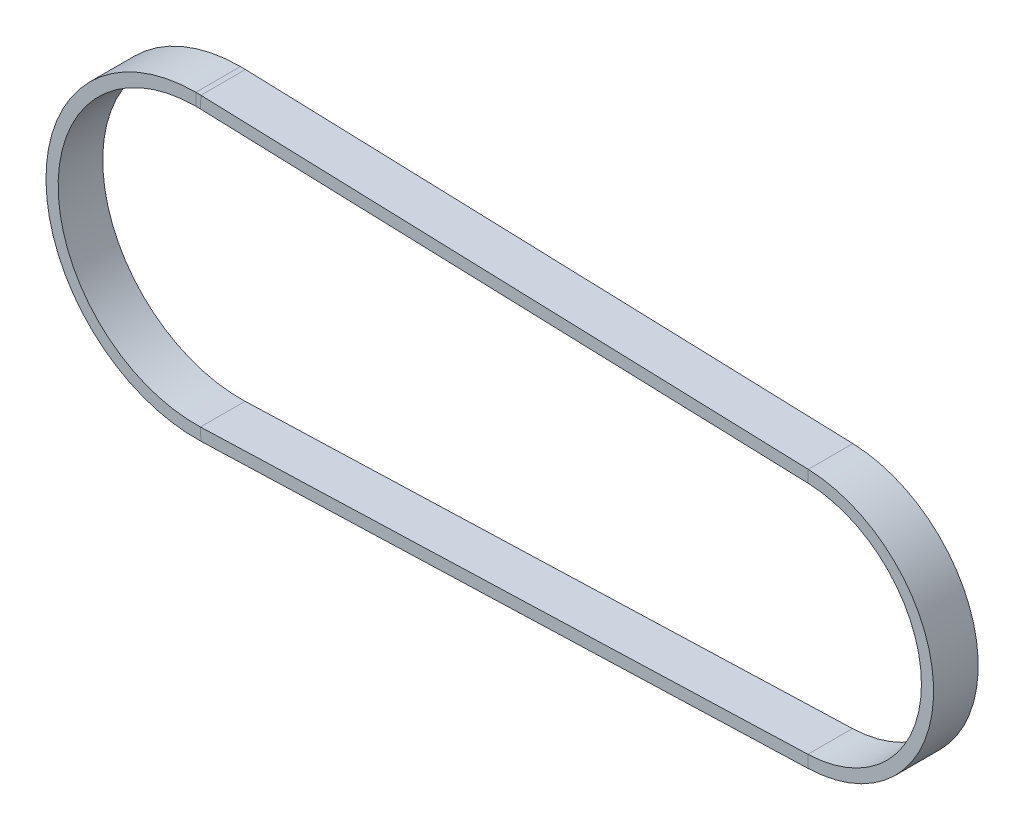
ISO-10303-21;
HEADER;
FILE_DESCRIPTION(('STEP AP214'),'2;1');
FILE_NAME('part.step','',(''),(''),'','','');
FILE_SCHEMA(('AUTOMOTIVE_DESIGN { 1 0 10303 214 1 1 1 1 }'));
ENDSEC;
DATA;
#1=APPLICATION_CONTEXT('core data for automotive mechanical design processes');
#2=APPLICATION_PROTOCOL_DEFINITION('international standard','automotive_design',2000,#1);
#3=PRODUCT_CONTEXT('',#1,'mechanical');
#4=PRODUCT('Part','Part','',(#3));
#5=PRODUCT_RELATED_PRODUCT_CATEGORY('part','',(#4));
#6=PRODUCT_DEFINITION_FORMATION('','',#4);
#7=PRODUCT_DEFINITION_CONTEXT('part definition',#1,'design');
#8=PRODUCT_DEFINITION('design','',#6,#7);
#9=PRODUCT_DEFINITION_SHAPE('','',#8);
#10=(LENGTH_UNIT() NAMED_UNIT(*) SI_UNIT(.MILLI.,.METRE.));
#11=(NAMED_UNIT(*) PLANE_ANGLE_UNIT() SI_UNIT($,.RADIAN.));
#12=(NAMED_UNIT(*) SI_UNIT($,.STERADIAN.) SOLID_ANGLE_UNIT());
#13=UNCERTAINTY_MEASURE_WITH_UNIT(LENGTH_MEASURE(1.E-05),#10,'distance_accuracy_value','');
#14=(GEOMETRIC_REPRESENTATION_CONTEXT(3) GLOBAL_UNCERTAINTY_ASSIGNED_CONTEXT((#13)) GLOBAL_UNIT_ASSIGNED_CONTEXT((#10,
#11,#12)) REPRESENTATION_CONTEXT('',''));
#15=CARTESIAN_POINT('',(0.,0.,0.));
#16=DIRECTION('',(0.,0.,1.));
#17=DIRECTION('',(1.,0.,0.));
#18=AXIS2_PLACEMENT_3D('',#15,#16,#17);
#19=CARTESIAN_POINT('',(1.23264795771311,-36.9588888888889,5.5));
#20=DIRECTION('',(0.,0.,1.));
#21=DIRECTION('',(1.,0.,0.));
#22=AXIS2_PLACEMENT_3D('',#19,#20,#21);
#23=PLANE('',#22);
#24=CARTESIAN_POINT('',(0.,0.,5.5));
#25=DIRECTION('',(0.,0.,-1.));
#26=DIRECTION('',(0.0333333333333332,-0.999444290037663,0.));
#27=AXIS2_PLACEMENT_3D('',#24,#25,#26);
#28=CIRCLE('',#27,36.9794387313936);
#29=CARTESIAN_POINT('',(1.23264795771311,-36.9588888888889,5.5));
#30=VERTEX_POINT('',#29);
#31=CARTESIAN_POINT('',(0.,36.9794387313936,5.5));
#32=VERTEX_POINT('',#31);
#33=EDGE_CURVE('E11',#30,#32,#28,.T.);
#34=ORIENTED_EDGE('',*,*,#33,.F.);
#35=DIRECTION('',(-0.0333333333333332,0.999444290037663,0.));
#36=VECTOR('',#35,1.);
#37=CARTESIAN_POINT('',(1.23264795771311,-36.9588888888889,5.5));
#38=LINE('',#37,#36);
#39=CARTESIAN_POINT('',(1.13264795771312,-33.9605560187759,5.5));
#40=VERTEX_POINT('',#39);
#41=EDGE_CURVE('E38',#30,#40,#38,.T.);
#42=ORIENTED_EDGE('',*,*,#41,.T.);
#43=CARTESIAN_POINT('',(0.,0.,5.5));
#44=DIRECTION('',(0.,0.,-1.));
#45=DIRECTION('',(0.0333333333333332,-0.999444290037663,0.));
#46=AXIS2_PLACEMENT_3D('',#43,#44,#45);
#47=CIRCLE('',#46,33.9794387313936);
#48=CARTESIAN_POINT('',(0.,33.9794387313936,5.5));
#49=VERTEX_POINT('',#48);
#50=EDGE_CURVE('E132',#40,#49,#47,.T.);
#51=ORIENTED_EDGE('',*,*,#50,.T.);
#52=DIRECTION('',(0.,-1.,0.));
#53=VECTOR('',#52,1.);
#54=CARTESIAN_POINT('',(0.,36.9794387313936,5.5));
#55=LINE('',#54,#53);
#56=EDGE_CURVE('E135',#32,#49,#55,.T.);
#57=ORIENTED_EDGE('',*,*,#56,.F.);
#58=EDGE_LOOP('',(#34,#42,#51,#57));
#59=FACE_BOUND('',#58,.T.);
#60=ADVANCED_FACE('F35',(#59),#23,.T.);
#61=CARTESIAN_POINT('',(0.,0.,0.));
#62=DIRECTION('',(0.,0.,-1.));
#63=DIRECTION('',(-1.,0.,0.));
#64=AXIS2_PLACEMENT_3D('',#61,#62,#63);
#65=CYLINDRICAL_SURFACE('',#64,36.9794387313936);
#66=CARTESIAN_POINT('',(0.,0.,-5.5));
#67=DIRECTION('',(0.,0.,-1.));
#68=DIRECTION('',(0.0333333333333332,-0.999444290037663,0.));
#69=AXIS2_PLACEMENT_3D('',#66,#67,#68);
#70=CIRCLE('',#69,36.9794387313936);
#71=CARTESIAN_POINT('',(1.23264795771311,-36.9588888888889,-5.5));
#72=VERTEX_POINT('',#71);
#73=CARTESIAN_POINT('',(0.,36.9794387313936,-5.5));
#74=VERTEX_POINT('',#73);
#75=EDGE_CURVE('E43',#72,#74,#70,.T.);
#76=ORIENTED_EDGE('',*,*,#75,.F.);
#77=DIRECTION('',(0.,0.,1.));
#78=VECTOR('',#77,1.);
#79=CARTESIAN_POINT('',(1.23264795771311,-36.9588888888889,5.5));
#80=LINE('',#79,#78);
#81=EDGE_CURVE('E218',#72,#30,#80,.T.);
#82=ORIENTED_EDGE('',*,*,#81,.T.);
#83=ORIENTED_EDGE('',*,*,#33,.T.);
#84=DIRECTION('',(0.,0.,1.));
#85=VECTOR('',#84,1.);
#86=CARTESIAN_POINT('',(0.,36.9794387313936,5.5));
#87=LINE('',#86,#85);
#88=EDGE_CURVE('E160',#74,#32,#87,.T.);
#89=ORIENTED_EDGE('',*,*,#88,.F.);
#90=EDGE_LOOP('',(#76,#82,#83,#89));
#91=FACE_BOUND('',#90,.T.);
#92=ADVANCED_FACE('F277',(#91),#65,.T.);
#93=CARTESIAN_POINT('',(1.13264795771311,-33.9605560187759,-5.5));
#94=DIRECTION('',(0.,0.,-1.));
#95=DIRECTION('',(-1.,0.,0.));
#96=AXIS2_PLACEMENT_3D('',#93,#94,#95);
#97=PLANE('',#96);
#98=CARTESIAN_POINT('',(0.,0.,-5.5));
#99=DIRECTION('',(0.,0.,-1.));
#100=DIRECTION('',(0.0333333333333332,-0.999444290037663,0.));
#101=AXIS2_PLACEMENT_3D('',#98,#99,#100);
#102=CIRCLE('',#101,33.9794387313936);
#103=CARTESIAN_POINT('',(1.13264795771312,-33.9605560187759,-5.5));
#104=VERTEX_POINT('',#103);
#105=CARTESIAN_POINT('',(0.,33.9794387313936,-5.5));
#106=VERTEX_POINT('',#105);
#107=EDGE_CURVE('E141',#104,#106,#102,.T.);
#108=ORIENTED_EDGE('',*,*,#107,.F.);
#109=DIRECTION('',(0.0333333333333332,-0.999444290037663,0.));
#110=VECTOR('',#109,1.);
#111=CARTESIAN_POINT('',(1.13264795771311,-33.9605560187759,-5.5));
#112=LINE('',#111,#110);
#113=EDGE_CURVE('E196',#104,#72,#112,.T.);
#114=ORIENTED_EDGE('',*,*,#113,.T.);
#115=ORIENTED_EDGE('',*,*,#75,.T.);
#116=DIRECTION('',(0.,1.,0.));
#117=VECTOR('',#116,1.);
#118=CARTESIAN_POINT('',(0.,33.9794387313936,-5.5));
#119=LINE('',#118,#117);
#120=EDGE_CURVE('E165',#106,#74,#119,.T.);
#121=ORIENTED_EDGE('',*,*,#120,.F.);
#122=EDGE_LOOP('',(#108,#114,#115,#121));
#123=FACE_BOUND('',#122,.T.);
#124=ADVANCED_FACE('F281',(#123),#97,.T.);
#125=CARTESIAN_POINT('',(151.065981291046,-31.9616674387006,5.5));
#126=DIRECTION('',(0.,0.,1.));
#127=DIRECTION('',(1.,0.,0.));
#128=AXIS2_PLACEMENT_3D('',#125,#126,#127);
#129=PLANE('',#128);
#130=ORIENTED_EDGE('',*,*,#41,.F.);
#131=DIRECTION('',(-0.999444290037663,-0.0333333333333334,0.));
#132=VECTOR('',#131,1.);
#133=CARTESIAN_POINT('',(151.065981291046,-31.9616674387006,5.5));
#134=LINE('',#133,#132);
#135=CARTESIAN_POINT('',(151.065981291046,-31.9616674387006,5.5));
#136=VERTEX_POINT('',#135);
#137=EDGE_CURVE('E51',#136,#30,#134,.T.);
#138=ORIENTED_EDGE('',*,*,#137,.F.);
#139=DIRECTION('',(-0.0333333333333321,0.999444290037663,0.));
#140=VECTOR('',#139,1.);
#141=CARTESIAN_POINT('',(151.065981291046,-31.9616674387006,5.5));
#142=LINE('',#141,#140);
#143=CARTESIAN_POINT('',(150.965981291046,-28.9633345685876,5.5));
#144=VERTEX_POINT('',#143);
#145=EDGE_CURVE('E200',#136,#144,#142,.T.);
#146=ORIENTED_EDGE('',*,*,#145,.T.);
#147=DIRECTION('',(-0.999444290037663,-0.0333333333333334,0.));
#148=VECTOR('',#147,1.);
#149=CARTESIAN_POINT('',(150.965981291046,-28.9633345685876,5.5));
#150=LINE('',#149,#148);
#151=EDGE_CURVE('E198',#144,#40,#150,.T.);
#152=ORIENTED_EDGE('',*,*,#151,.T.);
#153=EDGE_LOOP('',(#130,#138,#146,#152));
#154=FACE_BOUND('',#153,.T.);
#155=ADVANCED_FACE('F240',(#154),#129,.T.);
#156=CARTESIAN_POINT('',(151.065981291046,-31.9616674387006,5.5));
#157=DIRECTION('',(0.0333333333333334,-0.999444290037663,0.));
#158=DIRECTION('',(0.999444290037663,0.0333333333333334,0.));
#159=AXIS2_PLACEMENT_3D('',#156,#157,#158);
#160=PLANE('',#159);
#161=ORIENTED_EDGE('',*,*,#137,.T.);
#162=ORIENTED_EDGE('',*,*,#81,.F.);
#163=DIRECTION('',(-0.999444290037663,-0.0333333333333334,0.));
#164=VECTOR('',#163,1.);
#165=CARTESIAN_POINT('',(151.065981291046,-31.9616674387006,-5.5));
#166=LINE('',#165,#164);
#167=CARTESIAN_POINT('',(151.065981291046,-31.9616674387006,-5.5));
#168=VERTEX_POINT('',#167);
#169=EDGE_CURVE('E60',#168,#72,#166,.T.);
#170=ORIENTED_EDGE('',*,*,#169,.F.);
#171=DIRECTION('',(0.,0.,1.));
#172=VECTOR('',#171,1.);
#173=CARTESIAN_POINT('',(151.065981291046,-31.9616674387006,5.5));
#174=LINE('',#173,#172);
#175=EDGE_CURVE('E215',#168,#136,#174,.T.);
#176=ORIENTED_EDGE('',*,*,#175,.T.);
#177=EDGE_LOOP('',(#161,#162,#170,#176));
#178=FACE_BOUND('',#177,.T.);
#179=ADVANCED_FACE('F266',(#178),#160,.T.);
#180=CARTESIAN_POINT('',(150.965981291046,-28.9633345685876,-5.5));
#181=DIRECTION('',(0.,0.,-1.));
#182=DIRECTION('',(-1.,0.,0.));
#183=AXIS2_PLACEMENT_3D('',#180,#181,#182);
#184=PLANE('',#183);
#185=ORIENTED_EDGE('',*,*,#169,.T.);
#186=ORIENTED_EDGE('',*,*,#113,.F.);
#187=DIRECTION('',(-0.999444290037663,-0.0333333333333334,0.));
#188=VECTOR('',#187,1.);
#189=CARTESIAN_POINT('',(150.965981291046,-28.9633345685876,-5.5));
#190=LINE('',#189,#188);
#191=CARTESIAN_POINT('',(150.965981291046,-28.9633345685876,-5.5));
#192=VERTEX_POINT('',#191);
#193=EDGE_CURVE('E93',#192,#104,#190,.T.);
#194=ORIENTED_EDGE('',*,*,#193,.F.);
#195=DIRECTION('',(0.0333333333333321,-0.999444290037663,0.));
#196=VECTOR('',#195,1.);
#197=CARTESIAN_POINT('',(150.965981291046,-28.9633345685876,-5.5));
#198=LINE('',#197,#196);
#199=EDGE_CURVE('E190',#192,#168,#198,.T.);
#200=ORIENTED_EDGE('',*,*,#199,.T.);
#201=EDGE_LOOP('',(#185,#186,#194,#200));
#202=FACE_BOUND('',#201,.T.);
#203=ADVANCED_FACE('F263',(#202),#184,.T.);
#204=CARTESIAN_POINT('',(150.965981291046,-28.9633345685876,5.5));
#205=DIRECTION('',(-0.0333333333333334,0.999444290037663,0.));
#206=DIRECTION('',(-0.999444290037663,-0.0333333333333334,0.));
#207=AXIS2_PLACEMENT_3D('',#204,#205,#206);
#208=PLANE('',#207);
#209=ORIENTED_EDGE('',*,*,#193,.T.);
#210=DIRECTION('',(0.,0.,-1.));
#211=VECTOR('',#210,1.);
#212=CARTESIAN_POINT('',(1.13264795771311,-33.9605560187759,5.5));
#213=LINE('',#212,#211);
#214=EDGE_CURVE('E194',#40,#104,#213,.T.);
#215=ORIENTED_EDGE('',*,*,#214,.F.);
#216=ORIENTED_EDGE('',*,*,#151,.F.);
#217=DIRECTION('',(0.,0.,-1.));
#218=VECTOR('',#217,1.);
#219=CARTESIAN_POINT('',(150.965981291046,-28.9633345685876,5.5));
#220=LINE('',#219,#218);
#221=EDGE_CURVE('E185',#144,#192,#220,.T.);
#222=ORIENTED_EDGE('',*,*,#221,.T.);
#223=EDGE_LOOP('',(#209,#215,#216,#222));
#224=FACE_BOUND('',#223,.T.);
#225=ADVANCED_FACE('F265',(#224),#208,.T.);
#226=CARTESIAN_POINT('',(151.065981291046,31.9616674387006,5.5));
#227=DIRECTION('',(0.,0.,1.));
#228=DIRECTION('',(1.,0.,0.));
#229=AXIS2_PLACEMENT_3D('',#226,#227,#228);
#230=PLANE('',#229);
#231=ORIENTED_EDGE('',*,*,#145,.F.);
#232=CARTESIAN_POINT('',(150.,0.,5.5));
#233=DIRECTION('',(0.,0.,-1.));
#234=DIRECTION('',(0.0333333333333327,0.999444290037663,0.));
#235=AXIS2_PLACEMENT_3D('',#232,#233,#234);
#236=CIRCLE('',#235,31.9794387313936);
#237=CARTESIAN_POINT('',(151.065981291046,31.9616674387006,5.5));
#238=VERTEX_POINT('',#237);
#239=EDGE_CURVE('E230',#238,#136,#236,.T.);
#240=ORIENTED_EDGE('',*,*,#239,.F.);
#241=DIRECTION('',(-0.0333333333333335,-0.999444290037663,0.));
#242=VECTOR('',#241,1.);
#243=CARTESIAN_POINT('',(151.065981291046,31.9616674387006,5.5));
#244=LINE('',#243,#242);
#245=CARTESIAN_POINT('',(150.965981291046,28.9633345685876,5.5));
#246=VERTEX_POINT('',#245);
#247=EDGE_CURVE('E193',#238,#246,#244,.T.);
#248=ORIENTED_EDGE('',*,*,#247,.T.);
#249=CARTESIAN_POINT('',(150.,0.,5.5));
#250=DIRECTION('',(0.,0.,-1.));
#251=DIRECTION('',(0.033333333333333,0.999444290037663,0.));
#252=AXIS2_PLACEMENT_3D('',#249,#250,#251);
#253=CIRCLE('',#252,28.9794387313936);
#254=EDGE_CURVE('E188',#246,#144,#253,.T.);
#255=ORIENTED_EDGE('',*,*,#254,.T.);
#256=EDGE_LOOP('',(#231,#240,#248,#255));
#257=FACE_BOUND('',#256,.T.);
#258=ADVANCED_FACE('F245',(#257),#230,.T.);
#259=CARTESIAN_POINT('',(150.,0.,0.));
#260=DIRECTION('',(0.,0.,-1.));
#261=DIRECTION('',(-1.,0.,0.));
#262=AXIS2_PLACEMENT_3D('',#259,#260,#261);
#263=CYLINDRICAL_SURFACE('',#262,31.9794387313936);
#264=ORIENTED_EDGE('',*,*,#239,.T.);
#265=ORIENTED_EDGE('',*,*,#175,.F.);
#266=CARTESIAN_POINT('',(150.,0.,-5.5));
#267=DIRECTION('',(0.,0.,-1.));
#268=DIRECTION('',(0.0333333333333327,0.999444290037663,0.));
#269=AXIS2_PLACEMENT_3D('',#266,#267,#268);
#270=CIRCLE('',#269,31.9794387313936);
#271=CARTESIAN_POINT('',(151.065981291046,31.9616674387006,-5.5));
#272=VERTEX_POINT('',#271);
#273=EDGE_CURVE('E109',#272,#168,#270,.T.);
#274=ORIENTED_EDGE('',*,*,#273,.F.);
#275=DIRECTION('',(0.,0.,1.));
#276=VECTOR('',#275,1.);
#277=CARTESIAN_POINT('',(151.065981291046,31.9616674387006,5.5));
#278=LINE('',#277,#276);
#279=EDGE_CURVE('E212',#272,#238,#278,.T.);
#280=ORIENTED_EDGE('',*,*,#279,.T.);
#281=EDGE_LOOP('',(#264,#265,#274,#280));
#282=FACE_BOUND('',#281,.T.);
#283=ADVANCED_FACE('F295',(#282),#263,.T.);
#284=CARTESIAN_POINT('',(150.965981291046,28.9633345685876,-5.5));
#285=DIRECTION('',(0.,0.,-1.));
#286=DIRECTION('',(-1.,0.,0.));
#287=AXIS2_PLACEMENT_3D('',#284,#285,#286);
#288=PLANE('',#287);
#289=ORIENTED_EDGE('',*,*,#273,.T.);
#290=ORIENTED_EDGE('',*,*,#199,.F.);
#291=CARTESIAN_POINT('',(150.,0.,-5.5));
#292=DIRECTION('',(0.,0.,-1.));
#293=DIRECTION('',(0.033333333333333,0.999444290037663,0.));
#294=AXIS2_PLACEMENT_3D('',#291,#292,#293);
#295=CIRCLE('',#294,28.9794387313936);
#296=CARTESIAN_POINT('',(150.965981291046,28.9633345685876,-5.5));
#297=VERTEX_POINT('',#296);
#298=EDGE_CURVE('E115',#297,#192,#295,.T.);
#299=ORIENTED_EDGE('',*,*,#298,.F.);
#300=DIRECTION('',(0.0333333333333335,0.999444290037663,0.));
#301=VECTOR('',#300,1.);
#302=CARTESIAN_POINT('',(150.965981291046,28.9633345685876,-5.5));
#303=LINE('',#302,#301);
#304=EDGE_CURVE('E181',#297,#272,#303,.T.);
#305=ORIENTED_EDGE('',*,*,#304,.T.);
#306=EDGE_LOOP('',(#289,#290,#299,#305));
#307=FACE_BOUND('',#306,.T.);
#308=ADVANCED_FACE('F262',(#307),#288,.T.);
#309=CARTESIAN_POINT('',(150.,0.,0.));
#310=DIRECTION('',(0.,0.,-1.));
#311=DIRECTION('',(-1.,0.,0.));
#312=AXIS2_PLACEMENT_3D('',#309,#310,#311);
#313=CYLINDRICAL_SURFACE('',#312,28.9794387313936);
#314=ORIENTED_EDGE('',*,*,#298,.T.);
#315=ORIENTED_EDGE('',*,*,#221,.F.);
#316=ORIENTED_EDGE('',*,*,#254,.F.);
#317=DIRECTION('',(0.,0.,-1.));
#318=VECTOR('',#317,1.);
#319=CARTESIAN_POINT('',(150.965981291046,28.9633345685876,5.5));
#320=LINE('',#319,#318);
#321=EDGE_CURVE('E174',#246,#297,#320,.T.);
#322=ORIENTED_EDGE('',*,*,#321,.T.);
#323=EDGE_LOOP('',(#314,#315,#316,#322));
#324=FACE_BOUND('',#323,.T.);
#325=ADVANCED_FACE('F243',(#324),#313,.F.);
#326=CARTESIAN_POINT('',(1.23264795771313,36.9588888888889,5.5));
#327=DIRECTION('',(0.,0.,1.));
#328=DIRECTION('',(1.,0.,0.));
#329=AXIS2_PLACEMENT_3D('',#326,#327,#328);
#330=PLANE('',#329);
#331=ORIENTED_EDGE('',*,*,#247,.F.);
#332=DIRECTION('',(0.999444290037663,-0.0333333333333334,0.));
#333=VECTOR('',#332,1.);
#334=CARTESIAN_POINT('',(1.23264795771313,36.9588888888889,5.5));
#335=LINE('',#334,#333);
#336=CARTESIAN_POINT('',(1.23264795771313,36.9588888888889,5.5));
#337=VERTEX_POINT('',#336);
#338=EDGE_CURVE('E226',#337,#238,#335,.T.);
#339=ORIENTED_EDGE('',*,*,#338,.F.);
#340=DIRECTION('',(-0.0333333333333335,-0.999444290037663,0.));
#341=VECTOR('',#340,1.);
#342=CARTESIAN_POINT('',(1.23264795771313,36.9588888888889,5.5));
#343=LINE('',#342,#341);
#344=CARTESIAN_POINT('',(1.13264795771312,33.9605560187759,5.5));
#345=VERTEX_POINT('',#344);
#346=EDGE_CURVE('E184',#337,#345,#343,.T.);
#347=ORIENTED_EDGE('',*,*,#346,.T.);
#348=DIRECTION('',(0.999444290037663,-0.0333333333333334,0.));
#349=VECTOR('',#348,1.);
#350=CARTESIAN_POINT('',(1.13264795771313,33.9605560187759,5.5));
#351=LINE('',#350,#349);
#352=EDGE_CURVE('E178',#345,#246,#351,.T.);
#353=ORIENTED_EDGE('',*,*,#352,.T.);
#354=EDGE_LOOP('',(#331,#339,#347,#353));
#355=FACE_BOUND('',#354,.T.);
#356=ADVANCED_FACE('F251',(#355),#330,.T.);
#357=CARTESIAN_POINT('',(1.23264795771313,36.9588888888889,5.5));
#358=DIRECTION('',(0.0333333333333334,0.999444290037663,0.));
#359=DIRECTION('',(-0.999444290037663,0.0333333333333334,0.));
#360=AXIS2_PLACEMENT_3D('',#357,#358,#359);
#361=PLANE('',#360);
#362=ORIENTED_EDGE('',*,*,#338,.T.);
#363=ORIENTED_EDGE('',*,*,#279,.F.);
#364=DIRECTION('',(0.999444290037663,-0.0333333333333334,0.));
#365=VECTOR('',#364,1.);
#366=CARTESIAN_POINT('',(1.23264795771313,36.9588888888889,-5.5));
#367=LINE('',#366,#365);
#368=CARTESIAN_POINT('',(1.23264795771313,36.9588888888889,-5.5));
#369=VERTEX_POINT('',#368);
#370=EDGE_CURVE('E209',#369,#272,#367,.T.);
#371=ORIENTED_EDGE('',*,*,#370,.F.);
#372=DIRECTION('',(0.,0.,1.));
#373=VECTOR('',#372,1.);
#374=CARTESIAN_POINT('',(1.23264795771313,36.9588888888889,5.5));
#375=LINE('',#374,#373);
#376=EDGE_CURVE('E207',#369,#337,#375,.T.);
#377=ORIENTED_EDGE('',*,*,#376,.T.);
#378=EDGE_LOOP('',(#362,#363,#371,#377));
#379=FACE_BOUND('',#378,.T.);
#380=ADVANCED_FACE('F258',(#379),#361,.T.);
#381=CARTESIAN_POINT('',(1.13264795771313,33.9605560187759,-5.5));
#382=DIRECTION('',(0.,0.,-1.));
#383=DIRECTION('',(-1.,0.,0.));
#384=AXIS2_PLACEMENT_3D('',#381,#382,#383);
#385=PLANE('',#384);
#386=ORIENTED_EDGE('',*,*,#370,.T.);
#387=ORIENTED_EDGE('',*,*,#304,.F.);
#388=DIRECTION('',(0.999444290037663,-0.0333333333333334,0.));
#389=VECTOR('',#388,1.);
#390=CARTESIAN_POINT('',(1.13264795771313,33.9605560187759,-5.5));
#391=LINE('',#390,#389);
#392=CARTESIAN_POINT('',(1.13264795771312,33.9605560187759,-5.5));
#393=VERTEX_POINT('',#392);
#394=EDGE_CURVE('E177',#393,#297,#391,.T.);
#395=ORIENTED_EDGE('',*,*,#394,.F.);
#396=DIRECTION('',(0.0333333333333335,0.999444290037663,0.));
#397=VECTOR('',#396,1.);
#398=CARTESIAN_POINT('',(1.13264795771312,33.9605560187759,-5.5));
#399=LINE('',#398,#397);
#400=EDGE_CURVE('E172',#393,#369,#399,.T.);
#401=ORIENTED_EDGE('',*,*,#400,.T.);
#402=EDGE_LOOP('',(#386,#387,#395,#401));
#403=FACE_BOUND('',#402,.T.);
#404=ADVANCED_FACE('F260',(#403),#385,.T.);
#405=CARTESIAN_POINT('',(1.13264795771313,33.9605560187759,5.5));
#406=DIRECTION('',(-0.0333333333333334,-0.999444290037663,0.));
#407=DIRECTION('',(0.999444290037663,-0.0333333333333334,0.));
#408=AXIS2_PLACEMENT_3D('',#405,#406,#407);
#409=PLANE('',#408);
#410=ORIENTED_EDGE('',*,*,#394,.T.);
#411=ORIENTED_EDGE('',*,*,#321,.F.);
#412=ORIENTED_EDGE('',*,*,#352,.F.);
#413=DIRECTION('',(0.,0.,-1.));
#414=VECTOR('',#413,1.);
#415=CARTESIAN_POINT('',(1.13264795771312,33.9605560187759,5.5));
#416=LINE('',#415,#414);
#417=EDGE_CURVE('E152',#345,#393,#416,.T.);
#418=ORIENTED_EDGE('',*,*,#417,.T.);
#419=EDGE_LOOP('',(#410,#411,#412,#418));
#420=FACE_BOUND('',#419,.T.);
#421=ADVANCED_FACE('F250',(#420),#409,.T.);
#422=CARTESIAN_POINT('',(0.,36.9794387313936,5.5));
#423=DIRECTION('',(0.,0.,1.));
#424=DIRECTION('',(1.,0.,0.));
#425=AXIS2_PLACEMENT_3D('',#422,#423,#424);
#426=PLANE('',#425);
#427=ORIENTED_EDGE('',*,*,#346,.F.);
#428=CARTESIAN_POINT('',(0.,0.,5.5));
#429=DIRECTION('',(0.,0.,-1.));
#430=DIRECTION('',(0.,1.,0.));
#431=AXIS2_PLACEMENT_3D('',#428,#429,#430);
#432=CIRCLE('',#431,36.9794387313936);
#433=EDGE_CURVE('E159',#32,#337,#432,.T.);
#434=ORIENTED_EDGE('',*,*,#433,.F.);
#435=ORIENTED_EDGE('',*,*,#56,.T.);
#436=CARTESIAN_POINT('',(0.,0.,5.5));
#437=DIRECTION('',(0.,0.,-1.));
#438=DIRECTION('',(0.,1.,0.));
#439=AXIS2_PLACEMENT_3D('',#436,#437,#438);
#440=CIRCLE('',#439,33.9794387313936);
#441=EDGE_CURVE('E147',#49,#345,#440,.T.);
#442=ORIENTED_EDGE('',*,*,#441,.T.);
#443=EDGE_LOOP('',(#427,#434,#435,#442));
#444=FACE_BOUND('',#443,.T.);
#445=ADVANCED_FACE('F157',(#444),#426,.T.);
#446=CARTESIAN_POINT('',(0.,0.,0.));
#447=DIRECTION('',(0.,0.,-1.));
#448=DIRECTION('',(-1.,0.,0.));
#449=AXIS2_PLACEMENT_3D('',#446,#447,#448);
#450=CYLINDRICAL_SURFACE('',#449,36.9794387313936);
#451=ORIENTED_EDGE('',*,*,#433,.T.);
#452=ORIENTED_EDGE('',*,*,#376,.F.);
#453=CARTESIAN_POINT('',(0.,0.,-5.5));
#454=DIRECTION('',(0.,0.,-1.));
#455=DIRECTION('',(0.,1.,0.));
#456=AXIS2_PLACEMENT_3D('',#453,#454,#455);
#457=CIRCLE('',#456,36.9794387313936);
#458=EDGE_CURVE('E204',#74,#369,#457,.T.);
#459=ORIENTED_EDGE('',*,*,#458,.F.);
#460=ORIENTED_EDGE('',*,*,#88,.T.);
#461=EDGE_LOOP('',(#451,#452,#459,#460));
#462=FACE_BOUND('',#461,.T.);
#463=ADVANCED_FACE('F254',(#462),#450,.T.);
#464=CARTESIAN_POINT('',(0.,33.9794387313936,-5.5));
#465=DIRECTION('',(0.,0.,-1.));
#466=DIRECTION('',(-1.,0.,0.));
#467=AXIS2_PLACEMENT_3D('',#464,#465,#466);
#468=PLANE('',#467);
#469=ORIENTED_EDGE('',*,*,#458,.T.);
#470=ORIENTED_EDGE('',*,*,#400,.F.);
#471=CARTESIAN_POINT('',(0.,0.,-5.5));
#472=DIRECTION('',(0.,0.,-1.));
#473=DIRECTION('',(0.,1.,0.));
#474=AXIS2_PLACEMENT_3D('',#471,#472,#473);
#475=CIRCLE('',#474,33.9794387313936);
#476=EDGE_CURVE('E171',#106,#393,#475,.T.);
#477=ORIENTED_EDGE('',*,*,#476,.F.);
#478=ORIENTED_EDGE('',*,*,#120,.T.);
#479=EDGE_LOOP('',(#469,#470,#477,#478));
#480=FACE_BOUND('',#479,.T.);
#481=ADVANCED_FACE('F388',(#480),#468,.T.);
#482=CARTESIAN_POINT('',(0.,0.,0.));
#483=DIRECTION('',(0.,0.,-1.));
#484=DIRECTION('',(-1.,0.,0.));
#485=AXIS2_PLACEMENT_3D('',#482,#483,#484);
#486=CYLINDRICAL_SURFACE('',#485,33.9794387313936);
#487=ORIENTED_EDGE('',*,*,#476,.T.);
#488=ORIENTED_EDGE('',*,*,#417,.F.);
#489=ORIENTED_EDGE('',*,*,#441,.F.);
#490=DIRECTION('',(0.,0.,-1.));
#491=VECTOR('',#490,1.);
#492=CARTESIAN_POINT('',(0.,33.9794387313936,5.5));
#493=LINE('',#492,#491);
#494=EDGE_CURVE('E150',#49,#106,#493,.T.);
#495=ORIENTED_EDGE('',*,*,#494,.T.);
#496=EDGE_LOOP('',(#487,#488,#489,#495));
#497=FACE_BOUND('',#496,.T.);
#498=ADVANCED_FACE('F149',(#497),#486,.F.);
#499=CARTESIAN_POINT('',(0.,0.,0.));
#500=DIRECTION('',(0.,0.,-1.));
#501=DIRECTION('',(-1.,0.,0.));
#502=AXIS2_PLACEMENT_3D('',#499,#500,#501);
#503=CYLINDRICAL_SURFACE('',#502,33.9794387313936);
#504=ORIENTED_EDGE('',*,*,#214,.T.);
#505=ORIENTED_EDGE('',*,*,#107,.T.);
#506=ORIENTED_EDGE('',*,*,#494,.F.);
#507=ORIENTED_EDGE('',*,*,#50,.F.);
#508=EDGE_LOOP('',(#504,#505,#506,#507));
#509=FACE_BOUND('',#508,.T.);
#510=ADVANCED_FACE('F162',(#509),#503,.F.);
#511=CLOSED_SHELL('',(#60,#92,#124,#155,#179,#203,#225,#258,#283,#308,#325,#356,#380,#404,#421,
#445,#463,#481,#498,#510));
#512=MANIFOLD_SOLID_BREP('B2',#511);
#513=ADVANCED_BREP_SHAPE_REPRESENTATION('',(#18,#512),#14);
#514=SHAPE_DEFINITION_REPRESENTATION(#9,#513);
ENDSEC;
END-ISO-10303-21;
